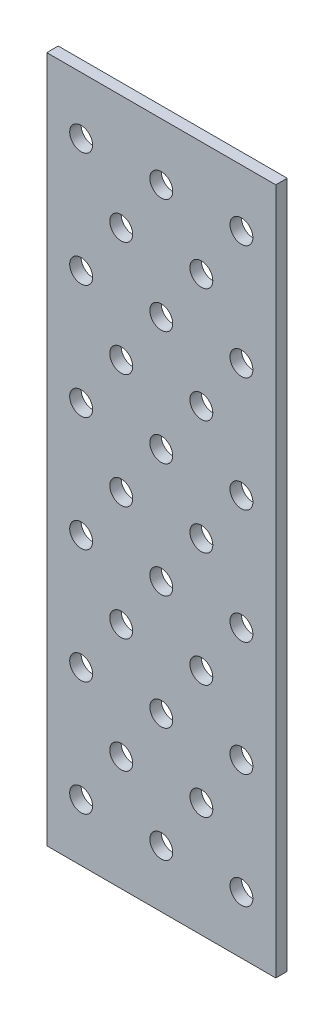
ISO-10303-21;
HEADER;
FILE_DESCRIPTION(('STEP AP214'),'2;1');
FILE_NAME('part.step','',(''),(''),'','','');
FILE_SCHEMA(('AUTOMOTIVE_DESIGN { 1 0 10303 214 1 1 1 1 }'));
ENDSEC;
DATA;
#1=APPLICATION_CONTEXT('core data for automotive mechanical design processes');
#2=APPLICATION_PROTOCOL_DEFINITION('international standard','automotive_design',2000,#1);
#3=PRODUCT_CONTEXT('',#1,'mechanical');
#4=PRODUCT('Part','Part','',(#3));
#5=PRODUCT_RELATED_PRODUCT_CATEGORY('part','',(#4));
#6=PRODUCT_DEFINITION_FORMATION('','',#4);
#7=PRODUCT_DEFINITION_CONTEXT('part definition',#1,'design');
#8=PRODUCT_DEFINITION('design','',#6,#7);
#9=PRODUCT_DEFINITION_SHAPE('','',#8);
#10=(LENGTH_UNIT() NAMED_UNIT(*) SI_UNIT(.MILLI.,.METRE.));
#11=(NAMED_UNIT(*) PLANE_ANGLE_UNIT() SI_UNIT($,.RADIAN.));
#12=(NAMED_UNIT(*) SI_UNIT($,.STERADIAN.) SOLID_ANGLE_UNIT());
#13=UNCERTAINTY_MEASURE_WITH_UNIT(LENGTH_MEASURE(1.E-05),#10,'distance_accuracy_value','');
#14=(GEOMETRIC_REPRESENTATION_CONTEXT(3) GLOBAL_UNCERTAINTY_ASSIGNED_CONTEXT((#13)) GLOBAL_UNIT_ASSIGNED_CONTEXT((#10,
#11,#12)) REPRESENTATION_CONTEXT('',''));
#15=CARTESIAN_POINT('',(0.,0.,0.));
#16=DIRECTION('',(0.,0.,1.));
#17=DIRECTION('',(1.,0.,0.));
#18=AXIS2_PLACEMENT_3D('',#15,#16,#17);
#19=CARTESIAN_POINT('',(20.,60.,-2.));
#20=DIRECTION('',(1.,0.,0.));
#21=DIRECTION('',(0.,1.,0.));
#22=AXIS2_PLACEMENT_3D('',#19,#20,#21);
#23=PLANE('',#22);
#24=DIRECTION('',(0.,1.,0.));
#25=VECTOR('',#24,1.);
#26=CARTESIAN_POINT('',(20.,60.,0.));
#27=LINE('',#26,#25);
#28=CARTESIAN_POINT('',(20.,-60.,0.));
#29=VERTEX_POINT('',#28);
#30=CARTESIAN_POINT('',(20.,60.,0.));
#31=VERTEX_POINT('',#30);
#32=EDGE_CURVE('E109',#29,#31,#27,.T.);
#33=ORIENTED_EDGE('',*,*,#32,.F.);
#34=DIRECTION('',(0.,0.,1.));
#35=VECTOR('',#34,1.);
#36=CARTESIAN_POINT('',(20.,-60.,-2.));
#37=LINE('',#36,#35);
#38=CARTESIAN_POINT('',(20.,-60.,-2.));
#39=VERTEX_POINT('',#38);
#40=EDGE_CURVE('E11',#39,#29,#37,.T.);
#41=ORIENTED_EDGE('',*,*,#40,.F.);
#42=DIRECTION('',(0.,1.,0.));
#43=VECTOR('',#42,1.);
#44=CARTESIAN_POINT('',(20.,60.,-2.));
#45=LINE('',#44,#43);
#46=CARTESIAN_POINT('',(20.,60.,-2.));
#47=VERTEX_POINT('',#46);
#48=EDGE_CURVE('E101',#39,#47,#45,.T.);
#49=ORIENTED_EDGE('',*,*,#48,.T.);
#50=DIRECTION('',(0.,0.,1.));
#51=VECTOR('',#50,1.);
#52=CARTESIAN_POINT('',(20.,60.,-2.));
#53=LINE('',#52,#51);
#54=EDGE_CURVE('E46',#47,#31,#53,.T.);
#55=ORIENTED_EDGE('',*,*,#54,.T.);
#56=EDGE_LOOP('',(#33,#41,#49,#55));
#57=FACE_BOUND('',#56,.T.);
#58=ADVANCED_FACE('F43',(#57),#23,.T.);
#59=CARTESIAN_POINT('',(-20.,-60.,-2.));
#60=DIRECTION('',(0.,-1.,0.));
#61=DIRECTION('',(0.,0.,-1.));
#62=AXIS2_PLACEMENT_3D('',#59,#60,#61);
#63=PLANE('',#62);
#64=DIRECTION('',(1.,0.,0.));
#65=VECTOR('',#64,1.);
#66=CARTESIAN_POINT('',(-20.,-60.,0.));
#67=LINE('',#66,#65);
#68=CARTESIAN_POINT('',(-20.,-60.,0.));
#69=VERTEX_POINT('',#68);
#70=EDGE_CURVE('E102',#69,#29,#67,.T.);
#71=ORIENTED_EDGE('',*,*,#70,.F.);
#72=DIRECTION('',(0.,0.,1.));
#73=VECTOR('',#72,1.);
#74=CARTESIAN_POINT('',(-20.,-60.,-2.));
#75=LINE('',#74,#73);
#76=CARTESIAN_POINT('',(-20.,-60.,-2.));
#77=VERTEX_POINT('',#76);
#78=EDGE_CURVE('E55',#77,#69,#75,.T.);
#79=ORIENTED_EDGE('',*,*,#78,.F.);
#80=DIRECTION('',(1.,0.,0.));
#81=VECTOR('',#80,1.);
#82=CARTESIAN_POINT('',(-20.,-60.,-2.));
#83=LINE('',#82,#81);
#84=EDGE_CURVE('E98',#77,#39,#83,.T.);
#85=ORIENTED_EDGE('',*,*,#84,.T.);
#86=ORIENTED_EDGE('',*,*,#40,.T.);
#87=EDGE_LOOP('',(#71,#79,#85,#86));
#88=FACE_BOUND('',#87,.T.);
#89=ADVANCED_FACE('F117',(#88),#63,.T.);
#90=CARTESIAN_POINT('',(-20.,60.,-2.));
#91=DIRECTION('',(-1.,0.,0.));
#92=DIRECTION('',(0.,-1.,0.));
#93=AXIS2_PLACEMENT_3D('',#90,#91,#92);
#94=PLANE('',#93);
#95=DIRECTION('',(0.,-1.,0.));
#96=VECTOR('',#95,1.);
#97=CARTESIAN_POINT('',(-20.,60.,0.));
#98=LINE('',#97,#96);
#99=CARTESIAN_POINT('',(-20.,60.,0.));
#100=VERTEX_POINT('',#99);
#101=EDGE_CURVE('E93',#100,#69,#98,.T.);
#102=ORIENTED_EDGE('',*,*,#101,.F.);
#103=DIRECTION('',(0.,0.,1.));
#104=VECTOR('',#103,1.);
#105=CARTESIAN_POINT('',(-20.,60.,-2.));
#106=LINE('',#105,#104);
#107=CARTESIAN_POINT('',(-20.,60.,-2.));
#108=VERTEX_POINT('',#107);
#109=EDGE_CURVE('E86',#108,#100,#106,.T.);
#110=ORIENTED_EDGE('',*,*,#109,.F.);
#111=DIRECTION('',(0.,-1.,0.));
#112=VECTOR('',#111,1.);
#113=CARTESIAN_POINT('',(-20.,60.,-2.));
#114=LINE('',#113,#112);
#115=EDGE_CURVE('E91',#108,#77,#114,.T.);
#116=ORIENTED_EDGE('',*,*,#115,.T.);
#117=ORIENTED_EDGE('',*,*,#78,.T.);
#118=EDGE_LOOP('',(#102,#110,#116,#117));
#119=FACE_BOUND('',#118,.T.);
#120=ADVANCED_FACE('F87',(#119),#94,.T.);
#121=CARTESIAN_POINT('',(-20.,60.,-2.));
#122=DIRECTION('',(0.,1.,0.));
#123=DIRECTION('',(0.,0.,1.));
#124=AXIS2_PLACEMENT_3D('',#121,#122,#123);
#125=PLANE('',#124);
#126=DIRECTION('',(-1.,0.,0.));
#127=VECTOR('',#126,1.);
#128=CARTESIAN_POINT('',(-20.,60.,0.));
#129=LINE('',#128,#127);
#130=EDGE_CURVE('E112',#31,#100,#129,.T.);
#131=ORIENTED_EDGE('',*,*,#130,.F.);
#132=ORIENTED_EDGE('',*,*,#54,.F.);
#133=DIRECTION('',(-1.,0.,0.));
#134=VECTOR('',#133,1.);
#135=CARTESIAN_POINT('',(-20.,60.,-2.));
#136=LINE('',#135,#134);
#137=EDGE_CURVE('E100',#47,#108,#136,.T.);
#138=ORIENTED_EDGE('',*,*,#137,.T.);
#139=ORIENTED_EDGE('',*,*,#109,.T.);
#140=EDGE_LOOP('',(#131,#132,#138,#139));
#141=FACE_BOUND('',#140,.T.);
#142=ADVANCED_FACE('F99',(#141),#125,.T.);
#143=CARTESIAN_POINT('',(0.,0.,-2.));
#144=DIRECTION('',(0.,0.,1.));
#145=DIRECTION('',(1.,0.,0.));
#146=AXIS2_PLACEMENT_3D('',#143,#144,#145);
#147=PLANE('',#146);
#148=CARTESIAN_POINT('',(14.,-50.,-2.));
#149=DIRECTION('',(0.,0.,1.));
#150=DIRECTION('',(1.,0.,0.));
#151=AXIS2_PLACEMENT_3D('',#148,#149,#150);
#152=CIRCLE('',#151,2.);
#153=CARTESIAN_POINT('',(16.,-50.,-2.));
#154=VERTEX_POINT('',#153);
#155=EDGE_CURVE('E257',#154,#154,#152,.T.);
#156=ORIENTED_EDGE('',*,*,#155,.T.);
#157=EDGE_LOOP('',(#156));
#158=FACE_BOUND('',#157,.T.);
#159=CARTESIAN_POINT('',(0.,-50.,-2.));
#160=DIRECTION('',(0.,0.,1.));
#161=DIRECTION('',(1.,0.,0.));
#162=AXIS2_PLACEMENT_3D('',#159,#160,#161);
#163=CIRCLE('',#162,2.);
#164=CARTESIAN_POINT('',(2.00000000000001,-50.,-2.));
#165=VERTEX_POINT('',#164);
#166=EDGE_CURVE('E261',#165,#165,#163,.T.);
#167=ORIENTED_EDGE('',*,*,#166,.T.);
#168=EDGE_LOOP('',(#167));
#169=FACE_BOUND('',#168,.T.);
#170=CARTESIAN_POINT('',(-14.,-50.,-2.));
#171=DIRECTION('',(0.,0.,1.));
#172=DIRECTION('',(1.,0.,0.));
#173=AXIS2_PLACEMENT_3D('',#170,#171,#172);
#174=CIRCLE('',#173,2.);
#175=CARTESIAN_POINT('',(-12.,-50.,-2.));
#176=VERTEX_POINT('',#175);
#177=EDGE_CURVE('E269',#176,#176,#174,.T.);
#178=ORIENTED_EDGE('',*,*,#177,.T.);
#179=EDGE_LOOP('',(#178));
#180=FACE_BOUND('',#179,.T.);
#181=CARTESIAN_POINT('',(7.00000000000001,-40.,-2.));
#182=DIRECTION('',(0.,0.,1.));
#183=DIRECTION('',(1.,0.,0.));
#184=AXIS2_PLACEMENT_3D('',#181,#182,#183);
#185=CIRCLE('',#184,2.);
#186=CARTESIAN_POINT('',(9.00000000000001,-40.,-2.));
#187=VERTEX_POINT('',#186);
#188=EDGE_CURVE('E278',#187,#187,#185,.T.);
#189=ORIENTED_EDGE('',*,*,#188,.T.);
#190=EDGE_LOOP('',(#189));
#191=FACE_BOUND('',#190,.T.);
#192=CARTESIAN_POINT('',(-6.99999999999999,-40.,-2.));
#193=DIRECTION('',(0.,0.,1.));
#194=DIRECTION('',(1.,0.,0.));
#195=AXIS2_PLACEMENT_3D('',#192,#193,#194);
#196=CIRCLE('',#195,2.);
#197=CARTESIAN_POINT('',(-4.99999999999999,-40.,-2.));
#198=VERTEX_POINT('',#197);
#199=EDGE_CURVE('E282',#198,#198,#196,.T.);
#200=ORIENTED_EDGE('',*,*,#199,.T.);
#201=EDGE_LOOP('',(#200));
#202=FACE_BOUND('',#201,.T.);
#203=CARTESIAN_POINT('',(14.,-30.,-2.));
#204=DIRECTION('',(0.,0.,1.));
#205=DIRECTION('',(1.,0.,0.));
#206=AXIS2_PLACEMENT_3D('',#203,#204,#205);
#207=CIRCLE('',#206,2.);
#208=CARTESIAN_POINT('',(16.,-30.,-2.));
#209=VERTEX_POINT('',#208);
#210=EDGE_CURVE('E286',#209,#209,#207,.T.);
#211=ORIENTED_EDGE('',*,*,#210,.T.);
#212=EDGE_LOOP('',(#211));
#213=FACE_BOUND('',#212,.T.);
#214=CARTESIAN_POINT('',(0.,-30.,-2.));
#215=DIRECTION('',(0.,0.,1.));
#216=DIRECTION('',(1.,0.,0.));
#217=AXIS2_PLACEMENT_3D('',#214,#215,#216);
#218=CIRCLE('',#217,2.);
#219=CARTESIAN_POINT('',(2.,-30.,-2.));
#220=VERTEX_POINT('',#219);
#221=EDGE_CURVE('E292',#220,#220,#218,.T.);
#222=ORIENTED_EDGE('',*,*,#221,.T.);
#223=EDGE_LOOP('',(#222));
#224=FACE_BOUND('',#223,.T.);
#225=CARTESIAN_POINT('',(-14.,-30.,-2.));
#226=DIRECTION('',(0.,0.,1.));
#227=DIRECTION('',(1.,0.,0.));
#228=AXIS2_PLACEMENT_3D('',#225,#226,#227);
#229=CIRCLE('',#228,2.);
#230=CARTESIAN_POINT('',(-12.,-30.,-2.));
#231=VERTEX_POINT('',#230);
#232=EDGE_CURVE('E299',#231,#231,#229,.T.);
#233=ORIENTED_EDGE('',*,*,#232,.T.);
#234=EDGE_LOOP('',(#233));
#235=FACE_BOUND('',#234,.T.);
#236=CARTESIAN_POINT('',(7.00000000000001,-20.,-2.));
#237=DIRECTION('',(0.,0.,1.));
#238=DIRECTION('',(1.,0.,0.));
#239=AXIS2_PLACEMENT_3D('',#236,#237,#238);
#240=CIRCLE('',#239,2.);
#241=CARTESIAN_POINT('',(9.00000000000001,-20.,-2.));
#242=VERTEX_POINT('',#241);
#243=EDGE_CURVE('E307',#242,#242,#240,.T.);
#244=ORIENTED_EDGE('',*,*,#243,.T.);
#245=EDGE_LOOP('',(#244));
#246=FACE_BOUND('',#245,.T.);
#247=CARTESIAN_POINT('',(-6.99999999999999,-20.,-2.));
#248=DIRECTION('',(0.,0.,1.));
#249=DIRECTION('',(1.,0.,0.));
#250=AXIS2_PLACEMENT_3D('',#247,#248,#249);
#251=CIRCLE('',#250,2.);
#252=CARTESIAN_POINT('',(-4.99999999999999,-20.,-2.));
#253=VERTEX_POINT('',#252);
#254=EDGE_CURVE('E315',#253,#253,#251,.T.);
#255=ORIENTED_EDGE('',*,*,#254,.T.);
#256=EDGE_LOOP('',(#255));
#257=FACE_BOUND('',#256,.T.);
#258=CARTESIAN_POINT('',(14.,-10.,-2.));
#259=DIRECTION('',(0.,0.,1.));
#260=DIRECTION('',(1.,0.,0.));
#261=AXIS2_PLACEMENT_3D('',#258,#259,#260);
#262=CIRCLE('',#261,2.);
#263=CARTESIAN_POINT('',(16.,-10.,-2.));
#264=VERTEX_POINT('',#263);
#265=EDGE_CURVE('E318',#264,#264,#262,.T.);
#266=ORIENTED_EDGE('',*,*,#265,.T.);
#267=EDGE_LOOP('',(#266));
#268=FACE_BOUND('',#267,.T.);
#269=CARTESIAN_POINT('',(0.,-10.,-2.));
#270=DIRECTION('',(0.,0.,1.));
#271=DIRECTION('',(1.,0.,0.));
#272=AXIS2_PLACEMENT_3D('',#269,#270,#271);
#273=CIRCLE('',#272,2.);
#274=CARTESIAN_POINT('',(2.,-10.,-2.));
#275=VERTEX_POINT('',#274);
#276=EDGE_CURVE('E324',#275,#275,#273,.T.);
#277=ORIENTED_EDGE('',*,*,#276,.T.);
#278=EDGE_LOOP('',(#277));
#279=FACE_BOUND('',#278,.T.);
#280=CARTESIAN_POINT('',(-14.,-10.,-2.));
#281=DIRECTION('',(0.,0.,1.));
#282=DIRECTION('',(1.,0.,0.));
#283=AXIS2_PLACEMENT_3D('',#280,#281,#282);
#284=CIRCLE('',#283,2.);
#285=CARTESIAN_POINT('',(-12.,-10.,-2.));
#286=VERTEX_POINT('',#285);
#287=EDGE_CURVE('E329',#286,#286,#284,.T.);
#288=ORIENTED_EDGE('',*,*,#287,.T.);
#289=EDGE_LOOP('',(#288));
#290=FACE_BOUND('',#289,.T.);
#291=CARTESIAN_POINT('',(7.,0.,-2.));
#292=DIRECTION('',(0.,0.,1.));
#293=DIRECTION('',(1.,0.,0.));
#294=AXIS2_PLACEMENT_3D('',#291,#292,#293);
#295=CIRCLE('',#294,2.);
#296=CARTESIAN_POINT('',(9.00000000000001,0.,-2.));
#297=VERTEX_POINT('',#296);
#298=EDGE_CURVE('E338',#297,#297,#295,.T.);
#299=ORIENTED_EDGE('',*,*,#298,.T.);
#300=EDGE_LOOP('',(#299));
#301=FACE_BOUND('',#300,.T.);
#302=CARTESIAN_POINT('',(-7.,0.,-2.));
#303=DIRECTION('',(0.,0.,1.));
#304=DIRECTION('',(1.,0.,0.));
#305=AXIS2_PLACEMENT_3D('',#302,#303,#304);
#306=CIRCLE('',#305,2.);
#307=CARTESIAN_POINT('',(-4.99999999999999,0.,-2.));
#308=VERTEX_POINT('',#307);
#309=EDGE_CURVE('E345',#308,#308,#306,.T.);
#310=ORIENTED_EDGE('',*,*,#309,.T.);
#311=EDGE_LOOP('',(#310));
#312=FACE_BOUND('',#311,.T.);
#313=CARTESIAN_POINT('',(14.,9.99999999999999,-2.));
#314=DIRECTION('',(0.,0.,1.));
#315=DIRECTION('',(1.,0.,0.));
#316=AXIS2_PLACEMENT_3D('',#313,#314,#315);
#317=CIRCLE('',#316,2.);
#318=CARTESIAN_POINT('',(16.,9.99999999999999,-2.));
#319=VERTEX_POINT('',#318);
#320=EDGE_CURVE('E348',#319,#319,#317,.T.);
#321=ORIENTED_EDGE('',*,*,#320,.T.);
#322=EDGE_LOOP('',(#321));
#323=FACE_BOUND('',#322,.T.);
#324=CARTESIAN_POINT('',(0.,9.99999999999999,-2.));
#325=DIRECTION('',(0.,0.,1.));
#326=DIRECTION('',(1.,0.,0.));
#327=AXIS2_PLACEMENT_3D('',#324,#325,#326);
#328=CIRCLE('',#327,2.);
#329=CARTESIAN_POINT('',(2.,9.99999999999999,-2.));
#330=VERTEX_POINT('',#329);
#331=EDGE_CURVE('E353',#330,#330,#328,.T.);
#332=ORIENTED_EDGE('',*,*,#331,.T.);
#333=EDGE_LOOP('',(#332));
#334=FACE_BOUND('',#333,.T.);
#335=CARTESIAN_POINT('',(-14.,9.99999999999999,-2.));
#336=DIRECTION('',(0.,0.,1.));
#337=DIRECTION('',(1.,0.,0.));
#338=AXIS2_PLACEMENT_3D('',#335,#336,#337);
#339=CIRCLE('',#338,2.);
#340=CARTESIAN_POINT('',(-12.,9.99999999999999,-2.));
#341=VERTEX_POINT('',#340);
#342=EDGE_CURVE('E358',#341,#341,#339,.T.);
#343=ORIENTED_EDGE('',*,*,#342,.T.);
#344=EDGE_LOOP('',(#343));
#345=FACE_BOUND('',#344,.T.);
#346=CARTESIAN_POINT('',(7.,20.,-2.));
#347=DIRECTION('',(0.,0.,1.));
#348=DIRECTION('',(1.,0.,0.));
#349=AXIS2_PLACEMENT_3D('',#346,#347,#348);
#350=CIRCLE('',#349,2.);
#351=CARTESIAN_POINT('',(9.,20.,-2.));
#352=VERTEX_POINT('',#351);
#353=EDGE_CURVE('E366',#352,#352,#350,.T.);
#354=ORIENTED_EDGE('',*,*,#353,.T.);
#355=EDGE_LOOP('',(#354));
#356=FACE_BOUND('',#355,.T.);
#357=CARTESIAN_POINT('',(-7.,20.,-2.));
#358=DIRECTION('',(0.,0.,1.));
#359=DIRECTION('',(1.,0.,0.));
#360=AXIS2_PLACEMENT_3D('',#357,#358,#359);
#361=CIRCLE('',#360,2.);
#362=CARTESIAN_POINT('',(-5.,20.,-2.));
#363=VERTEX_POINT('',#362);
#364=EDGE_CURVE('E375',#363,#363,#361,.T.);
#365=ORIENTED_EDGE('',*,*,#364,.T.);
#366=EDGE_LOOP('',(#365));
#367=FACE_BOUND('',#366,.T.);
#368=CARTESIAN_POINT('',(14.,30.,-2.));
#369=DIRECTION('',(0.,0.,1.));
#370=DIRECTION('',(1.,0.,0.));
#371=AXIS2_PLACEMENT_3D('',#368,#369,#370);
#372=CIRCLE('',#371,2.);
#373=CARTESIAN_POINT('',(16.,30.,-2.));
#374=VERTEX_POINT('',#373);
#375=EDGE_CURVE('E376',#374,#374,#372,.T.);
#376=ORIENTED_EDGE('',*,*,#375,.T.);
#377=EDGE_LOOP('',(#376));
#378=FACE_BOUND('',#377,.T.);
#379=CARTESIAN_POINT('',(0.,30.,-2.));
#380=DIRECTION('',(0.,0.,1.));
#381=DIRECTION('',(1.,0.,0.));
#382=AXIS2_PLACEMENT_3D('',#379,#380,#381);
#383=CIRCLE('',#382,2.);
#384=CARTESIAN_POINT('',(2.,30.,-2.));
#385=VERTEX_POINT('',#384);
#386=EDGE_CURVE('E385',#385,#385,#383,.T.);
#387=ORIENTED_EDGE('',*,*,#386,.T.);
#388=EDGE_LOOP('',(#387));
#389=FACE_BOUND('',#388,.T.);
#390=CARTESIAN_POINT('',(-14.,30.,-2.));
#391=DIRECTION('',(0.,0.,1.));
#392=DIRECTION('',(1.,0.,0.));
#393=AXIS2_PLACEMENT_3D('',#390,#391,#392);
#394=CIRCLE('',#393,2.);
#395=CARTESIAN_POINT('',(-12.,30.,-2.));
#396=VERTEX_POINT('',#395);
#397=EDGE_CURVE('E387',#396,#396,#394,.T.);
#398=ORIENTED_EDGE('',*,*,#397,.T.);
#399=EDGE_LOOP('',(#398));
#400=FACE_BOUND('',#399,.T.);
#401=CARTESIAN_POINT('',(7.,40.,-2.));
#402=DIRECTION('',(0.,0.,1.));
#403=DIRECTION('',(1.,0.,0.));
#404=AXIS2_PLACEMENT_3D('',#401,#402,#403);
#405=CIRCLE('',#404,2.);
#406=CARTESIAN_POINT('',(9.,40.,-2.));
#407=VERTEX_POINT('',#406);
#408=EDGE_CURVE('E396',#407,#407,#405,.T.);
#409=ORIENTED_EDGE('',*,*,#408,.T.);
#410=EDGE_LOOP('',(#409));
#411=FACE_BOUND('',#410,.T.);
#412=CARTESIAN_POINT('',(-7.,40.,-2.));
#413=DIRECTION('',(0.,0.,1.));
#414=DIRECTION('',(1.,0.,0.));
#415=AXIS2_PLACEMENT_3D('',#412,#413,#414);
#416=CIRCLE('',#415,2.);
#417=CARTESIAN_POINT('',(-5.,40.,-2.));
#418=VERTEX_POINT('',#417);
#419=EDGE_CURVE('E405',#418,#418,#416,.T.);
#420=ORIENTED_EDGE('',*,*,#419,.T.);
#421=EDGE_LOOP('',(#420));
#422=FACE_BOUND('',#421,.T.);
#423=CARTESIAN_POINT('',(14.,50.,-2.));
#424=DIRECTION('',(0.,0.,1.));
#425=DIRECTION('',(1.,0.,0.));
#426=AXIS2_PLACEMENT_3D('',#423,#424,#425);
#427=CIRCLE('',#426,2.);
#428=CARTESIAN_POINT('',(16.,50.,-2.));
#429=VERTEX_POINT('',#428);
#430=EDGE_CURVE('E409',#429,#429,#427,.T.);
#431=ORIENTED_EDGE('',*,*,#430,.T.);
#432=EDGE_LOOP('',(#431));
#433=FACE_BOUND('',#432,.T.);
#434=CARTESIAN_POINT('',(0.,50.,-2.));
#435=DIRECTION('',(0.,0.,1.));
#436=DIRECTION('',(1.,0.,0.));
#437=AXIS2_PLACEMENT_3D('',#434,#435,#436);
#438=CIRCLE('',#437,2.);
#439=CARTESIAN_POINT('',(1.99999999999999,50.,-2.));
#440=VERTEX_POINT('',#439);
#441=EDGE_CURVE('E411',#440,#440,#438,.T.);
#442=ORIENTED_EDGE('',*,*,#441,.T.);
#443=EDGE_LOOP('',(#442));
#444=FACE_BOUND('',#443,.T.);
#445=CARTESIAN_POINT('',(-14.,50.,-2.));
#446=DIRECTION('',(0.,0.,1.));
#447=DIRECTION('',(1.,0.,0.));
#448=AXIS2_PLACEMENT_3D('',#445,#446,#447);
#449=CIRCLE('',#448,2.);
#450=CARTESIAN_POINT('',(-12.,50.,-2.));
#451=VERTEX_POINT('',#450);
#452=EDGE_CURVE('E115',#451,#451,#449,.T.);
#453=ORIENTED_EDGE('',*,*,#452,.T.);
#454=EDGE_LOOP('',(#453));
#455=FACE_BOUND('',#454,.T.);
#456=ORIENTED_EDGE('',*,*,#48,.F.);
#457=ORIENTED_EDGE('',*,*,#84,.F.);
#458=ORIENTED_EDGE('',*,*,#115,.F.);
#459=ORIENTED_EDGE('',*,*,#137,.F.);
#460=EDGE_LOOP('',(#456,#457,#458,#459));
#461=FACE_BOUND('',#460,.T.);
#462=ADVANCED_FACE('F96',(#158,#169,#180,#191,#202,#213,#224,#235,#246,#257,#268,#279,#290,#301,
#312,#323,#334,#345,#356,#367,#378,#389,#400,#411,#422,#433,#444,#455,#461),#147,.F.);
#463=CARTESIAN_POINT('',(0.,0.,0.));
#464=DIRECTION('',(0.,0.,1.));
#465=DIRECTION('',(1.,0.,0.));
#466=AXIS2_PLACEMENT_3D('',#463,#464,#465);
#467=PLANE('',#466);
#468=CARTESIAN_POINT('',(14.,-50.,0.));
#469=DIRECTION('',(0.,0.,1.));
#470=DIRECTION('',(1.,0.,0.));
#471=AXIS2_PLACEMENT_3D('',#468,#469,#470);
#472=CIRCLE('',#471,2.);
#473=CARTESIAN_POINT('',(16.,-50.,0.));
#474=VERTEX_POINT('',#473);
#475=EDGE_CURVE('E256',#474,#474,#472,.T.);
#476=ORIENTED_EDGE('',*,*,#475,.F.);
#477=EDGE_LOOP('',(#476));
#478=FACE_BOUND('',#477,.T.);
#479=CARTESIAN_POINT('',(0.,-50.,0.));
#480=DIRECTION('',(0.,0.,1.));
#481=DIRECTION('',(1.,0.,0.));
#482=AXIS2_PLACEMENT_3D('',#479,#480,#481);
#483=CIRCLE('',#482,2.);
#484=CARTESIAN_POINT('',(2.00000000000001,-50.,0.));
#485=VERTEX_POINT('',#484);
#486=EDGE_CURVE('E262',#485,#485,#483,.T.);
#487=ORIENTED_EDGE('',*,*,#486,.F.);
#488=EDGE_LOOP('',(#487));
#489=FACE_BOUND('',#488,.T.);
#490=CARTESIAN_POINT('',(-14.,-50.,0.));
#491=DIRECTION('',(0.,0.,1.));
#492=DIRECTION('',(1.,0.,0.));
#493=AXIS2_PLACEMENT_3D('',#490,#491,#492);
#494=CIRCLE('',#493,2.);
#495=CARTESIAN_POINT('',(-12.,-50.,0.));
#496=VERTEX_POINT('',#495);
#497=EDGE_CURVE('E270',#496,#496,#494,.T.);
#498=ORIENTED_EDGE('',*,*,#497,.F.);
#499=EDGE_LOOP('',(#498));
#500=FACE_BOUND('',#499,.T.);
#501=CARTESIAN_POINT('',(7.00000000000001,-40.,0.));
#502=DIRECTION('',(0.,0.,1.));
#503=DIRECTION('',(1.,0.,0.));
#504=AXIS2_PLACEMENT_3D('',#501,#502,#503);
#505=CIRCLE('',#504,2.);
#506=CARTESIAN_POINT('',(9.00000000000001,-40.,0.));
#507=VERTEX_POINT('',#506);
#508=EDGE_CURVE('E271',#507,#507,#505,.T.);
#509=ORIENTED_EDGE('',*,*,#508,.F.);
#510=EDGE_LOOP('',(#509));
#511=FACE_BOUND('',#510,.T.);
#512=CARTESIAN_POINT('',(-6.99999999999999,-40.,0.));
#513=DIRECTION('',(0.,0.,1.));
#514=DIRECTION('',(1.,0.,0.));
#515=AXIS2_PLACEMENT_3D('',#512,#513,#514);
#516=CIRCLE('',#515,2.);
#517=CARTESIAN_POINT('',(-4.99999999999999,-40.,0.));
#518=VERTEX_POINT('',#517);
#519=EDGE_CURVE('E277',#518,#518,#516,.T.);
#520=ORIENTED_EDGE('',*,*,#519,.F.);
#521=EDGE_LOOP('',(#520));
#522=FACE_BOUND('',#521,.T.);
#523=CARTESIAN_POINT('',(14.,-30.,0.));
#524=DIRECTION('',(0.,0.,1.));
#525=DIRECTION('',(1.,0.,0.));
#526=AXIS2_PLACEMENT_3D('',#523,#524,#525);
#527=CIRCLE('',#526,2.);
#528=CARTESIAN_POINT('',(16.,-30.,0.));
#529=VERTEX_POINT('',#528);
#530=EDGE_CURVE('E284',#529,#529,#527,.T.);
#531=ORIENTED_EDGE('',*,*,#530,.F.);
#532=EDGE_LOOP('',(#531));
#533=FACE_BOUND('',#532,.T.);
#534=CARTESIAN_POINT('',(0.,-30.,0.));
#535=DIRECTION('',(0.,0.,1.));
#536=DIRECTION('',(1.,0.,0.));
#537=AXIS2_PLACEMENT_3D('',#534,#535,#536);
#538=CIRCLE('',#537,2.);
#539=CARTESIAN_POINT('',(2.,-30.,0.));
#540=VERTEX_POINT('',#539);
#541=EDGE_CURVE('E291',#540,#540,#538,.T.);
#542=ORIENTED_EDGE('',*,*,#541,.F.);
#543=EDGE_LOOP('',(#542));
#544=FACE_BOUND('',#543,.T.);
#545=CARTESIAN_POINT('',(-14.,-30.,0.));
#546=DIRECTION('',(0.,0.,1.));
#547=DIRECTION('',(1.,0.,0.));
#548=AXIS2_PLACEMENT_3D('',#545,#546,#547);
#549=CIRCLE('',#548,2.);
#550=CARTESIAN_POINT('',(-12.,-30.,0.));
#551=VERTEX_POINT('',#550);
#552=EDGE_CURVE('E300',#551,#551,#549,.T.);
#553=ORIENTED_EDGE('',*,*,#552,.F.);
#554=EDGE_LOOP('',(#553));
#555=FACE_BOUND('',#554,.T.);
#556=CARTESIAN_POINT('',(7.00000000000001,-20.,0.));
#557=DIRECTION('',(0.,0.,1.));
#558=DIRECTION('',(1.,0.,0.));
#559=AXIS2_PLACEMENT_3D('',#556,#557,#558);
#560=CIRCLE('',#559,2.);
#561=CARTESIAN_POINT('',(9.00000000000001,-20.,0.));
#562=VERTEX_POINT('',#561);
#563=EDGE_CURVE('E302',#562,#562,#560,.T.);
#564=ORIENTED_EDGE('',*,*,#563,.F.);
#565=EDGE_LOOP('',(#564));
#566=FACE_BOUND('',#565,.T.);
#567=CARTESIAN_POINT('',(-6.99999999999999,-20.,0.));
#568=DIRECTION('',(0.,0.,1.));
#569=DIRECTION('',(1.,0.,0.));
#570=AXIS2_PLACEMENT_3D('',#567,#568,#569);
#571=CIRCLE('',#570,2.);
#572=CARTESIAN_POINT('',(-4.99999999999999,-20.,0.));
#573=VERTEX_POINT('',#572);
#574=EDGE_CURVE('E306',#573,#573,#571,.T.);
#575=ORIENTED_EDGE('',*,*,#574,.F.);
#576=EDGE_LOOP('',(#575));
#577=FACE_BOUND('',#576,.T.);
#578=CARTESIAN_POINT('',(14.,-10.,0.));
#579=DIRECTION('',(0.,0.,1.));
#580=DIRECTION('',(1.,0.,0.));
#581=AXIS2_PLACEMENT_3D('',#578,#579,#580);
#582=CIRCLE('',#581,2.);
#583=CARTESIAN_POINT('',(16.,-10.,0.));
#584=VERTEX_POINT('',#583);
#585=EDGE_CURVE('E313',#584,#584,#582,.T.);
#586=ORIENTED_EDGE('',*,*,#585,.F.);
#587=EDGE_LOOP('',(#586));
#588=FACE_BOUND('',#587,.T.);
#589=CARTESIAN_POINT('',(0.,-10.,0.));
#590=DIRECTION('',(0.,0.,1.));
#591=DIRECTION('',(1.,0.,0.));
#592=AXIS2_PLACEMENT_3D('',#589,#590,#591);
#593=CIRCLE('',#592,2.);
#594=CARTESIAN_POINT('',(2.,-10.,0.));
#595=VERTEX_POINT('',#594);
#596=EDGE_CURVE('E322',#595,#595,#593,.T.);
#597=ORIENTED_EDGE('',*,*,#596,.F.);
#598=EDGE_LOOP('',(#597));
#599=FACE_BOUND('',#598,.T.);
#600=CARTESIAN_POINT('',(-14.,-10.,0.));
#601=DIRECTION('',(0.,0.,1.));
#602=DIRECTION('',(1.,0.,0.));
#603=AXIS2_PLACEMENT_3D('',#600,#601,#602);
#604=CIRCLE('',#603,2.);
#605=CARTESIAN_POINT('',(-12.,-10.,0.));
#606=VERTEX_POINT('',#605);
#607=EDGE_CURVE('E330',#606,#606,#604,.T.);
#608=ORIENTED_EDGE('',*,*,#607,.F.);
#609=EDGE_LOOP('',(#608));
#610=FACE_BOUND('',#609,.T.);
#611=CARTESIAN_POINT('',(7.,0.,0.));
#612=DIRECTION('',(0.,0.,1.));
#613=DIRECTION('',(1.,0.,0.));
#614=AXIS2_PLACEMENT_3D('',#611,#612,#613);
#615=CIRCLE('',#614,2.);
#616=CARTESIAN_POINT('',(9.00000000000001,0.,0.));
#617=VERTEX_POINT('',#616);
#618=EDGE_CURVE('E331',#617,#617,#615,.T.);
#619=ORIENTED_EDGE('',*,*,#618,.F.);
#620=EDGE_LOOP('',(#619));
#621=FACE_BOUND('',#620,.T.);
#622=CARTESIAN_POINT('',(-7.,0.,0.));
#623=DIRECTION('',(0.,0.,1.));
#624=DIRECTION('',(1.,0.,0.));
#625=AXIS2_PLACEMENT_3D('',#622,#623,#624);
#626=CIRCLE('',#625,2.);
#627=CARTESIAN_POINT('',(-4.99999999999999,0.,0.));
#628=VERTEX_POINT('',#627);
#629=EDGE_CURVE('E339',#628,#628,#626,.T.);
#630=ORIENTED_EDGE('',*,*,#629,.F.);
#631=EDGE_LOOP('',(#630));
#632=FACE_BOUND('',#631,.T.);
#633=CARTESIAN_POINT('',(14.,9.99999999999999,0.));
#634=DIRECTION('',(0.,0.,1.));
#635=DIRECTION('',(1.,0.,0.));
#636=AXIS2_PLACEMENT_3D('',#633,#634,#635);
#637=CIRCLE('',#636,2.);
#638=CARTESIAN_POINT('',(16.,9.99999999999999,0.));
#639=VERTEX_POINT('',#638);
#640=EDGE_CURVE('E344',#639,#639,#637,.T.);
#641=ORIENTED_EDGE('',*,*,#640,.F.);
#642=EDGE_LOOP('',(#641));
#643=FACE_BOUND('',#642,.T.);
#644=CARTESIAN_POINT('',(0.,9.99999999999999,0.));
#645=DIRECTION('',(0.,0.,1.));
#646=DIRECTION('',(1.,0.,0.));
#647=AXIS2_PLACEMENT_3D('',#644,#645,#646);
#648=CIRCLE('',#647,2.);
#649=CARTESIAN_POINT('',(2.,9.99999999999999,0.));
#650=VERTEX_POINT('',#649);
#651=EDGE_CURVE('E351',#650,#650,#648,.T.);
#652=ORIENTED_EDGE('',*,*,#651,.F.);
#653=EDGE_LOOP('',(#652));
#654=FACE_BOUND('',#653,.T.);
#655=CARTESIAN_POINT('',(-14.,9.99999999999999,0.));
#656=DIRECTION('',(0.,0.,1.));
#657=DIRECTION('',(1.,0.,0.));
#658=AXIS2_PLACEMENT_3D('',#655,#656,#657);
#659=CIRCLE('',#658,2.);
#660=CARTESIAN_POINT('',(-12.,9.99999999999999,0.));
#661=VERTEX_POINT('',#660);
#662=EDGE_CURVE('E360',#661,#661,#659,.T.);
#663=ORIENTED_EDGE('',*,*,#662,.F.);
#664=EDGE_LOOP('',(#663));
#665=FACE_BOUND('',#664,.T.);
#666=CARTESIAN_POINT('',(7.,20.,0.));
#667=DIRECTION('',(0.,0.,1.));
#668=DIRECTION('',(1.,0.,0.));
#669=AXIS2_PLACEMENT_3D('',#666,#667,#668);
#670=CIRCLE('',#669,2.);
#671=CARTESIAN_POINT('',(9.,20.,0.));
#672=VERTEX_POINT('',#671);
#673=EDGE_CURVE('E364',#672,#672,#670,.T.);
#674=ORIENTED_EDGE('',*,*,#673,.F.);
#675=EDGE_LOOP('',(#674));
#676=FACE_BOUND('',#675,.T.);
#677=CARTESIAN_POINT('',(-7.,20.,0.));
#678=DIRECTION('',(0.,0.,1.));
#679=DIRECTION('',(1.,0.,0.));
#680=AXIS2_PLACEMENT_3D('',#677,#678,#679);
#681=CIRCLE('',#680,2.);
#682=CARTESIAN_POINT('',(-5.,20.,0.));
#683=VERTEX_POINT('',#682);
#684=EDGE_CURVE('E367',#683,#683,#681,.T.);
#685=ORIENTED_EDGE('',*,*,#684,.F.);
#686=EDGE_LOOP('',(#685));
#687=FACE_BOUND('',#686,.T.);
#688=CARTESIAN_POINT('',(14.,30.,0.));
#689=DIRECTION('',(0.,0.,1.));
#690=DIRECTION('',(1.,0.,0.));
#691=AXIS2_PLACEMENT_3D('',#688,#689,#690);
#692=CIRCLE('',#691,2.);
#693=CARTESIAN_POINT('',(16.,30.,0.));
#694=VERTEX_POINT('',#693);
#695=EDGE_CURVE('E373',#694,#694,#692,.T.);
#696=ORIENTED_EDGE('',*,*,#695,.F.);
#697=EDGE_LOOP('',(#696));
#698=FACE_BOUND('',#697,.T.);
#699=CARTESIAN_POINT('',(0.,30.,0.));
#700=DIRECTION('',(0.,0.,1.));
#701=DIRECTION('',(1.,0.,0.));
#702=AXIS2_PLACEMENT_3D('',#699,#700,#701);
#703=CIRCLE('',#702,2.);
#704=CARTESIAN_POINT('',(2.,30.,0.));
#705=VERTEX_POINT('',#704);
#706=EDGE_CURVE('E383',#705,#705,#703,.T.);
#707=ORIENTED_EDGE('',*,*,#706,.F.);
#708=EDGE_LOOP('',(#707));
#709=FACE_BOUND('',#708,.T.);
#710=CARTESIAN_POINT('',(-14.,30.,0.));
#711=DIRECTION('',(0.,0.,1.));
#712=DIRECTION('',(1.,0.,0.));
#713=AXIS2_PLACEMENT_3D('',#710,#711,#712);
#714=CIRCLE('',#713,2.);
#715=CARTESIAN_POINT('',(-12.,30.,0.));
#716=VERTEX_POINT('',#715);
#717=EDGE_CURVE('E390',#716,#716,#714,.T.);
#718=ORIENTED_EDGE('',*,*,#717,.F.);
#719=EDGE_LOOP('',(#718));
#720=FACE_BOUND('',#719,.T.);
#721=CARTESIAN_POINT('',(7.,40.,0.));
#722=DIRECTION('',(0.,0.,1.));
#723=DIRECTION('',(1.,0.,0.));
#724=AXIS2_PLACEMENT_3D('',#721,#722,#723);
#725=CIRCLE('',#724,2.);
#726=CARTESIAN_POINT('',(9.,40.,0.));
#727=VERTEX_POINT('',#726);
#728=EDGE_CURVE('E393',#727,#727,#725,.T.);
#729=ORIENTED_EDGE('',*,*,#728,.F.);
#730=EDGE_LOOP('',(#729));
#731=FACE_BOUND('',#730,.T.);
#732=CARTESIAN_POINT('',(-7.,40.,0.));
#733=DIRECTION('',(0.,0.,1.));
#734=DIRECTION('',(1.,0.,0.));
#735=AXIS2_PLACEMENT_3D('',#732,#733,#734);
#736=CIRCLE('',#735,2.);
#737=CARTESIAN_POINT('',(-5.,40.,0.));
#738=VERTEX_POINT('',#737);
#739=EDGE_CURVE('E397',#738,#738,#736,.T.);
#740=ORIENTED_EDGE('',*,*,#739,.F.);
#741=EDGE_LOOP('',(#740));
#742=FACE_BOUND('',#741,.T.);
#743=CARTESIAN_POINT('',(14.,50.,0.));
#744=DIRECTION('',(0.,0.,1.));
#745=DIRECTION('',(1.,0.,0.));
#746=AXIS2_PLACEMENT_3D('',#743,#744,#745);
#747=CIRCLE('',#746,2.);
#748=CARTESIAN_POINT('',(16.,50.,0.));
#749=VERTEX_POINT('',#748);
#750=EDGE_CURVE('E404',#749,#749,#747,.T.);
#751=ORIENTED_EDGE('',*,*,#750,.F.);
#752=EDGE_LOOP('',(#751));
#753=FACE_BOUND('',#752,.T.);
#754=CARTESIAN_POINT('',(0.,50.,0.));
#755=DIRECTION('',(0.,0.,1.));
#756=DIRECTION('',(1.,0.,0.));
#757=AXIS2_PLACEMENT_3D('',#754,#755,#756);
#758=CIRCLE('',#757,2.);
#759=CARTESIAN_POINT('',(1.99999999999999,50.,0.));
#760=VERTEX_POINT('',#759);
#761=EDGE_CURVE('E412',#760,#760,#758,.T.);
#762=ORIENTED_EDGE('',*,*,#761,.F.);
#763=EDGE_LOOP('',(#762));
#764=FACE_BOUND('',#763,.T.);
#765=CARTESIAN_POINT('',(-14.,50.,0.));
#766=DIRECTION('',(0.,0.,1.));
#767=DIRECTION('',(1.,0.,0.));
#768=AXIS2_PLACEMENT_3D('',#765,#766,#767);
#769=CIRCLE('',#768,2.);
#770=CARTESIAN_POINT('',(-12.,50.,0.));
#771=VERTEX_POINT('',#770);
#772=EDGE_CURVE('E420',#771,#771,#769,.T.);
#773=ORIENTED_EDGE('',*,*,#772,.F.);
#774=EDGE_LOOP('',(#773));
#775=FACE_BOUND('',#774,.T.);
#776=ORIENTED_EDGE('',*,*,#32,.T.);
#777=ORIENTED_EDGE('',*,*,#130,.T.);
#778=ORIENTED_EDGE('',*,*,#101,.T.);
#779=ORIENTED_EDGE('',*,*,#70,.T.);
#780=EDGE_LOOP('',(#776,#777,#778,#779));
#781=FACE_BOUND('',#780,.T.);
#782=ADVANCED_FACE('F118',(#478,#489,#500,#511,#522,#533,#544,#555,#566,#577,#588,#599,#610,
#621,#632,#643,#654,#665,#676,#687,#698,#709,#720,#731,#742,#753,#764,#775,#781),#467,.T.);
#783=CARTESIAN_POINT('',(-14.,50.,-2.));
#784=DIRECTION('',(0.,0.,1.));
#785=DIRECTION('',(1.,0.,0.));
#786=AXIS2_PLACEMENT_3D('',#783,#784,#785);
#787=CYLINDRICAL_SURFACE('',#786,2.);
#788=ORIENTED_EDGE('',*,*,#452,.F.);
#789=EDGE_LOOP('',(#788));
#790=FACE_BOUND('',#789,.T.);
#791=ORIENTED_EDGE('',*,*,#772,.T.);
#792=EDGE_LOOP('',(#791));
#793=FACE_BOUND('',#792,.T.);
#794=ADVANCED_FACE('F140',(#790,#793),#787,.F.);
#795=CARTESIAN_POINT('',(0.,50.,-2.));
#796=DIRECTION('',(0.,0.,1.));
#797=DIRECTION('',(1.,0.,0.));
#798=AXIS2_PLACEMENT_3D('',#795,#796,#797);
#799=CYLINDRICAL_SURFACE('',#798,2.);
#800=ORIENTED_EDGE('',*,*,#441,.F.);
#801=EDGE_LOOP('',(#800));
#802=FACE_BOUND('',#801,.T.);
#803=ORIENTED_EDGE('',*,*,#761,.T.);
#804=EDGE_LOOP('',(#803));
#805=FACE_BOUND('',#804,.T.);
#806=ADVANCED_FACE('F142',(#802,#805),#799,.F.);
#807=CARTESIAN_POINT('',(14.,50.,-2.));
#808=DIRECTION('',(0.,0.,1.));
#809=DIRECTION('',(1.,0.,0.));
#810=AXIS2_PLACEMENT_3D('',#807,#808,#809);
#811=CYLINDRICAL_SURFACE('',#810,2.);
#812=ORIENTED_EDGE('',*,*,#430,.F.);
#813=EDGE_LOOP('',(#812));
#814=FACE_BOUND('',#813,.T.);
#815=ORIENTED_EDGE('',*,*,#750,.T.);
#816=EDGE_LOOP('',(#815));
#817=FACE_BOUND('',#816,.T.);
#818=ADVANCED_FACE('F148',(#814,#817),#811,.F.);
#819=CARTESIAN_POINT('',(-7.,40.,-2.));
#820=DIRECTION('',(0.,0.,1.));
#821=DIRECTION('',(1.,0.,0.));
#822=AXIS2_PLACEMENT_3D('',#819,#820,#821);
#823=CYLINDRICAL_SURFACE('',#822,2.);
#824=ORIENTED_EDGE('',*,*,#419,.F.);
#825=EDGE_LOOP('',(#824));
#826=FACE_BOUND('',#825,.T.);
#827=ORIENTED_EDGE('',*,*,#739,.T.);
#828=EDGE_LOOP('',(#827));
#829=FACE_BOUND('',#828,.T.);
#830=ADVANCED_FACE('F155',(#826,#829),#823,.F.);
#831=CARTESIAN_POINT('',(7.,40.,-2.));
#832=DIRECTION('',(0.,0.,1.));
#833=DIRECTION('',(1.,0.,0.));
#834=AXIS2_PLACEMENT_3D('',#831,#832,#833);
#835=CYLINDRICAL_SURFACE('',#834,2.);
#836=ORIENTED_EDGE('',*,*,#408,.F.);
#837=EDGE_LOOP('',(#836));
#838=FACE_BOUND('',#837,.T.);
#839=ORIENTED_EDGE('',*,*,#728,.T.);
#840=EDGE_LOOP('',(#839));
#841=FACE_BOUND('',#840,.T.);
#842=ADVANCED_FACE('F157',(#838,#841),#835,.F.);
#843=CARTESIAN_POINT('',(-14.,30.,-2.));
#844=DIRECTION('',(0.,0.,1.));
#845=DIRECTION('',(1.,0.,0.));
#846=AXIS2_PLACEMENT_3D('',#843,#844,#845);
#847=CYLINDRICAL_SURFACE('',#846,2.);
#848=ORIENTED_EDGE('',*,*,#397,.F.);
#849=EDGE_LOOP('',(#848));
#850=FACE_BOUND('',#849,.T.);
#851=ORIENTED_EDGE('',*,*,#717,.T.);
#852=EDGE_LOOP('',(#851));
#853=FACE_BOUND('',#852,.T.);
#854=ADVANCED_FACE('F158',(#850,#853),#847,.F.);
#855=CARTESIAN_POINT('',(0.,30.,-2.));
#856=DIRECTION('',(0.,0.,1.));
#857=DIRECTION('',(1.,0.,0.));
#858=AXIS2_PLACEMENT_3D('',#855,#856,#857);
#859=CYLINDRICAL_SURFACE('',#858,2.);
#860=ORIENTED_EDGE('',*,*,#386,.F.);
#861=EDGE_LOOP('',(#860));
#862=FACE_BOUND('',#861,.T.);
#863=ORIENTED_EDGE('',*,*,#706,.T.);
#864=EDGE_LOOP('',(#863));
#865=FACE_BOUND('',#864,.T.);
#866=ADVANCED_FACE('F161',(#862,#865),#859,.F.);
#867=CARTESIAN_POINT('',(14.,30.,-2.));
#868=DIRECTION('',(0.,0.,1.));
#869=DIRECTION('',(1.,0.,0.));
#870=AXIS2_PLACEMENT_3D('',#867,#868,#869);
#871=CYLINDRICAL_SURFACE('',#870,2.);
#872=ORIENTED_EDGE('',*,*,#375,.F.);
#873=EDGE_LOOP('',(#872));
#874=FACE_BOUND('',#873,.T.);
#875=ORIENTED_EDGE('',*,*,#695,.T.);
#876=EDGE_LOOP('',(#875));
#877=FACE_BOUND('',#876,.T.);
#878=ADVANCED_FACE('F168',(#874,#877),#871,.F.);
#879=CARTESIAN_POINT('',(-7.,20.,-2.));
#880=DIRECTION('',(0.,0.,1.));
#881=DIRECTION('',(1.,0.,0.));
#882=AXIS2_PLACEMENT_3D('',#879,#880,#881);
#883=CYLINDRICAL_SURFACE('',#882,2.);
#884=ORIENTED_EDGE('',*,*,#364,.F.);
#885=EDGE_LOOP('',(#884));
#886=FACE_BOUND('',#885,.T.);
#887=ORIENTED_EDGE('',*,*,#684,.T.);
#888=EDGE_LOOP('',(#887));
#889=FACE_BOUND('',#888,.T.);
#890=ADVANCED_FACE('F175',(#886,#889),#883,.F.);
#891=CARTESIAN_POINT('',(7.,20.,-2.));
#892=DIRECTION('',(0.,0.,1.));
#893=DIRECTION('',(1.,0.,0.));
#894=AXIS2_PLACEMENT_3D('',#891,#892,#893);
#895=CYLINDRICAL_SURFACE('',#894,2.);
#896=ORIENTED_EDGE('',*,*,#353,.F.);
#897=EDGE_LOOP('',(#896));
#898=FACE_BOUND('',#897,.T.);
#899=ORIENTED_EDGE('',*,*,#673,.T.);
#900=EDGE_LOOP('',(#899));
#901=FACE_BOUND('',#900,.T.);
#902=ADVANCED_FACE('F178',(#898,#901),#895,.F.);
#903=CARTESIAN_POINT('',(-14.,9.99999999999999,-2.));
#904=DIRECTION('',(0.,0.,1.));
#905=DIRECTION('',(1.,0.,0.));
#906=AXIS2_PLACEMENT_3D('',#903,#904,#905);
#907=CYLINDRICAL_SURFACE('',#906,2.);
#908=ORIENTED_EDGE('',*,*,#342,.F.);
#909=EDGE_LOOP('',(#908));
#910=FACE_BOUND('',#909,.T.);
#911=ORIENTED_EDGE('',*,*,#662,.T.);
#912=EDGE_LOOP('',(#911));
#913=FACE_BOUND('',#912,.T.);
#914=ADVANCED_FACE('F179',(#910,#913),#907,.F.);
#915=CARTESIAN_POINT('',(0.,9.99999999999999,-2.));
#916=DIRECTION('',(0.,0.,1.));
#917=DIRECTION('',(1.,0.,0.));
#918=AXIS2_PLACEMENT_3D('',#915,#916,#917);
#919=CYLINDRICAL_SURFACE('',#918,2.);
#920=ORIENTED_EDGE('',*,*,#331,.F.);
#921=EDGE_LOOP('',(#920));
#922=FACE_BOUND('',#921,.T.);
#923=ORIENTED_EDGE('',*,*,#651,.T.);
#924=EDGE_LOOP('',(#923));
#925=FACE_BOUND('',#924,.T.);
#926=ADVANCED_FACE('F185',(#922,#925),#919,.F.);
#927=CARTESIAN_POINT('',(14.,9.99999999999999,-2.));
#928=DIRECTION('',(0.,0.,1.));
#929=DIRECTION('',(1.,0.,0.));
#930=AXIS2_PLACEMENT_3D('',#927,#928,#929);
#931=CYLINDRICAL_SURFACE('',#930,2.);
#932=ORIENTED_EDGE('',*,*,#320,.F.);
#933=EDGE_LOOP('',(#932));
#934=FACE_BOUND('',#933,.T.);
#935=ORIENTED_EDGE('',*,*,#640,.T.);
#936=EDGE_LOOP('',(#935));
#937=FACE_BOUND('',#936,.T.);
#938=ADVANCED_FACE('F186',(#934,#937),#931,.F.);
#939=CARTESIAN_POINT('',(-7.,0.,-2.));
#940=DIRECTION('',(0.,0.,1.));
#941=DIRECTION('',(1.,0.,0.));
#942=AXIS2_PLACEMENT_3D('',#939,#940,#941);
#943=CYLINDRICAL_SURFACE('',#942,2.);
#944=ORIENTED_EDGE('',*,*,#309,.F.);
#945=EDGE_LOOP('',(#944));
#946=FACE_BOUND('',#945,.T.);
#947=ORIENTED_EDGE('',*,*,#629,.T.);
#948=EDGE_LOOP('',(#947));
#949=FACE_BOUND('',#948,.T.);
#950=ADVANCED_FACE('F195',(#946,#949),#943,.F.);
#951=CARTESIAN_POINT('',(7.,0.,-2.));
#952=DIRECTION('',(0.,0.,1.));
#953=DIRECTION('',(1.,0.,0.));
#954=AXIS2_PLACEMENT_3D('',#951,#952,#953);
#955=CYLINDRICAL_SURFACE('',#954,2.);
#956=ORIENTED_EDGE('',*,*,#298,.F.);
#957=EDGE_LOOP('',(#956));
#958=FACE_BOUND('',#957,.T.);
#959=ORIENTED_EDGE('',*,*,#618,.T.);
#960=EDGE_LOOP('',(#959));
#961=FACE_BOUND('',#960,.T.);
#962=ADVANCED_FACE('F196',(#958,#961),#955,.F.);
#963=CARTESIAN_POINT('',(-14.,-10.,-2.));
#964=DIRECTION('',(0.,0.,1.));
#965=DIRECTION('',(1.,0.,0.));
#966=AXIS2_PLACEMENT_3D('',#963,#964,#965);
#967=CYLINDRICAL_SURFACE('',#966,2.);
#968=ORIENTED_EDGE('',*,*,#287,.F.);
#969=EDGE_LOOP('',(#968));
#970=FACE_BOUND('',#969,.T.);
#971=ORIENTED_EDGE('',*,*,#607,.T.);
#972=EDGE_LOOP('',(#971));
#973=FACE_BOUND('',#972,.T.);
#974=ADVANCED_FACE('F199',(#970,#973),#967,.F.);
#975=CARTESIAN_POINT('',(0.,-10.,-2.));
#976=DIRECTION('',(0.,0.,1.));
#977=DIRECTION('',(1.,0.,0.));
#978=AXIS2_PLACEMENT_3D('',#975,#976,#977);
#979=CYLINDRICAL_SURFACE('',#978,2.);
#980=ORIENTED_EDGE('',*,*,#276,.F.);
#981=EDGE_LOOP('',(#980));
#982=FACE_BOUND('',#981,.T.);
#983=ORIENTED_EDGE('',*,*,#596,.T.);
#984=EDGE_LOOP('',(#983));
#985=FACE_BOUND('',#984,.T.);
#986=ADVANCED_FACE('F203',(#982,#985),#979,.F.);
#987=CARTESIAN_POINT('',(14.,-10.,-2.));
#988=DIRECTION('',(0.,0.,1.));
#989=DIRECTION('',(1.,0.,0.));
#990=AXIS2_PLACEMENT_3D('',#987,#988,#989);
#991=CYLINDRICAL_SURFACE('',#990,2.);
#992=ORIENTED_EDGE('',*,*,#265,.F.);
#993=EDGE_LOOP('',(#992));
#994=FACE_BOUND('',#993,.T.);
#995=ORIENTED_EDGE('',*,*,#585,.T.);
#996=EDGE_LOOP('',(#995));
#997=FACE_BOUND('',#996,.T.);
#998=ADVANCED_FACE('F209',(#994,#997),#991,.F.);
#999=CARTESIAN_POINT('',(-6.99999999999999,-20.,-2.));
#1000=DIRECTION('',(0.,0.,1.));
#1001=DIRECTION('',(1.,0.,0.));
#1002=AXIS2_PLACEMENT_3D('',#999,#1000,#1001);
#1003=CYLINDRICAL_SURFACE('',#1002,2.);
#1004=ORIENTED_EDGE('',*,*,#254,.F.);
#1005=EDGE_LOOP('',(#1004));
#1006=FACE_BOUND('',#1005,.T.);
#1007=ORIENTED_EDGE('',*,*,#574,.T.);
#1008=EDGE_LOOP('',(#1007));
#1009=FACE_BOUND('',#1008,.T.);
#1010=ADVANCED_FACE('F215',(#1006,#1009),#1003,.F.);
#1011=CARTESIAN_POINT('',(7.00000000000001,-20.,-2.));
#1012=DIRECTION('',(0.,0.,1.));
#1013=DIRECTION('',(1.,0.,0.));
#1014=AXIS2_PLACEMENT_3D('',#1011,#1012,#1013);
#1015=CYLINDRICAL_SURFACE('',#1014,2.);
#1016=ORIENTED_EDGE('',*,*,#243,.F.);
#1017=EDGE_LOOP('',(#1016));
#1018=FACE_BOUND('',#1017,.T.);
#1019=ORIENTED_EDGE('',*,*,#563,.T.);
#1020=EDGE_LOOP('',(#1019));
#1021=FACE_BOUND('',#1020,.T.);
#1022=ADVANCED_FACE('F216',(#1018,#1021),#1015,.F.);
#1023=CARTESIAN_POINT('',(-14.,-30.,-2.));
#1024=DIRECTION('',(0.,0.,1.));
#1025=DIRECTION('',(1.,0.,0.));
#1026=AXIS2_PLACEMENT_3D('',#1023,#1024,#1025);
#1027=CYLINDRICAL_SURFACE('',#1026,2.);
#1028=ORIENTED_EDGE('',*,*,#232,.F.);
#1029=EDGE_LOOP('',(#1028));
#1030=FACE_BOUND('',#1029,.T.);
#1031=ORIENTED_EDGE('',*,*,#552,.T.);
#1032=EDGE_LOOP('',(#1031));
#1033=FACE_BOUND('',#1032,.T.);
#1034=ADVANCED_FACE('F219',(#1030,#1033),#1027,.F.);
#1035=CARTESIAN_POINT('',(0.,-30.,-2.));
#1036=DIRECTION('',(0.,0.,1.));
#1037=DIRECTION('',(1.,0.,0.));
#1038=AXIS2_PLACEMENT_3D('',#1035,#1036,#1037);
#1039=CYLINDRICAL_SURFACE('',#1038,2.);
#1040=ORIENTED_EDGE('',*,*,#221,.F.);
#1041=EDGE_LOOP('',(#1040));
#1042=FACE_BOUND('',#1041,.T.);
#1043=ORIENTED_EDGE('',*,*,#541,.T.);
#1044=EDGE_LOOP('',(#1043));
#1045=FACE_BOUND('',#1044,.T.);
#1046=ADVANCED_FACE('F224',(#1042,#1045),#1039,.F.);
#1047=CARTESIAN_POINT('',(14.,-30.,-2.));
#1048=DIRECTION('',(0.,0.,1.));
#1049=DIRECTION('',(1.,0.,0.));
#1050=AXIS2_PLACEMENT_3D('',#1047,#1048,#1049);
#1051=CYLINDRICAL_SURFACE('',#1050,2.);
#1052=ORIENTED_EDGE('',*,*,#210,.F.);
#1053=EDGE_LOOP('',(#1052));
#1054=FACE_BOUND('',#1053,.T.);
#1055=ORIENTED_EDGE('',*,*,#530,.T.);
#1056=EDGE_LOOP('',(#1055));
#1057=FACE_BOUND('',#1056,.T.);
#1058=ADVANCED_FACE('F226',(#1054,#1057),#1051,.F.);
#1059=CARTESIAN_POINT('',(-6.99999999999999,-40.,-2.));
#1060=DIRECTION('',(0.,0.,1.));
#1061=DIRECTION('',(1.,0.,0.));
#1062=AXIS2_PLACEMENT_3D('',#1059,#1060,#1061);
#1063=CYLINDRICAL_SURFACE('',#1062,2.);
#1064=ORIENTED_EDGE('',*,*,#199,.F.);
#1065=EDGE_LOOP('',(#1064));
#1066=FACE_BOUND('',#1065,.T.);
#1067=ORIENTED_EDGE('',*,*,#519,.T.);
#1068=EDGE_LOOP('',(#1067));
#1069=FACE_BOUND('',#1068,.T.);
#1070=ADVANCED_FACE('F232',(#1066,#1069),#1063,.F.);
#1071=CARTESIAN_POINT('',(7.00000000000001,-40.,-2.));
#1072=DIRECTION('',(0.,0.,1.));
#1073=DIRECTION('',(1.,0.,0.));
#1074=AXIS2_PLACEMENT_3D('',#1071,#1072,#1073);
#1075=CYLINDRICAL_SURFACE('',#1074,2.);
#1076=ORIENTED_EDGE('',*,*,#188,.F.);
#1077=EDGE_LOOP('',(#1076));
#1078=FACE_BOUND('',#1077,.T.);
#1079=ORIENTED_EDGE('',*,*,#508,.T.);
#1080=EDGE_LOOP('',(#1079));
#1081=FACE_BOUND('',#1080,.T.);
#1082=ADVANCED_FACE('F238',(#1078,#1081),#1075,.F.);
#1083=CARTESIAN_POINT('',(-14.,-50.,-2.));
#1084=DIRECTION('',(0.,0.,1.));
#1085=DIRECTION('',(1.,0.,0.));
#1086=AXIS2_PLACEMENT_3D('',#1083,#1084,#1085);
#1087=CYLINDRICAL_SURFACE('',#1086,2.);
#1088=ORIENTED_EDGE('',*,*,#177,.F.);
#1089=EDGE_LOOP('',(#1088));
#1090=FACE_BOUND('',#1089,.T.);
#1091=ORIENTED_EDGE('',*,*,#497,.T.);
#1092=EDGE_LOOP('',(#1091));
#1093=FACE_BOUND('',#1092,.T.);
#1094=ADVANCED_FACE('F237',(#1090,#1093),#1087,.F.);
#1095=CARTESIAN_POINT('',(0.,-50.,-2.));
#1096=DIRECTION('',(0.,0.,1.));
#1097=DIRECTION('',(1.,0.,0.));
#1098=AXIS2_PLACEMENT_3D('',#1095,#1096,#1097);
#1099=CYLINDRICAL_SURFACE('',#1098,2.);
#1100=ORIENTED_EDGE('',*,*,#166,.F.);
#1101=EDGE_LOOP('',(#1100));
#1102=FACE_BOUND('',#1101,.T.);
#1103=ORIENTED_EDGE('',*,*,#486,.T.);
#1104=EDGE_LOOP('',(#1103));
#1105=FACE_BOUND('',#1104,.T.);
#1106=ADVANCED_FACE('F242',(#1102,#1105),#1099,.F.);
#1107=CARTESIAN_POINT('',(14.,-50.,-2.));
#1108=DIRECTION('',(0.,0.,1.));
#1109=DIRECTION('',(1.,0.,0.));
#1110=AXIS2_PLACEMENT_3D('',#1107,#1108,#1109);
#1111=CYLINDRICAL_SURFACE('',#1110,2.);
#1112=ORIENTED_EDGE('',*,*,#155,.F.);
#1113=EDGE_LOOP('',(#1112));
#1114=FACE_BOUND('',#1113,.T.);
#1115=ORIENTED_EDGE('',*,*,#475,.T.);
#1116=EDGE_LOOP('',(#1115));
#1117=FACE_BOUND('',#1116,.T.);
#1118=ADVANCED_FACE('F248',(#1114,#1117),#1111,.F.);
#1119=CLOSED_SHELL('',(#58,#89,#120,#142,#462,#782,#794,#806,#818,#830,#842,#854,#866,#878,#890,
#902,#914,#926,#938,#950,#962,#974,#986,#998,#1010,#1022,#1034,#1046,#1058,#1070,#1082,#1094,
#1106,#1118));
#1120=MANIFOLD_SOLID_BREP('B2',#1119);
#1121=ADVANCED_BREP_SHAPE_REPRESENTATION('',(#18,#1120),#14);
#1122=SHAPE_DEFINITION_REPRESENTATION(#9,#1121);
ENDSEC;
END-ISO-10303-21;
